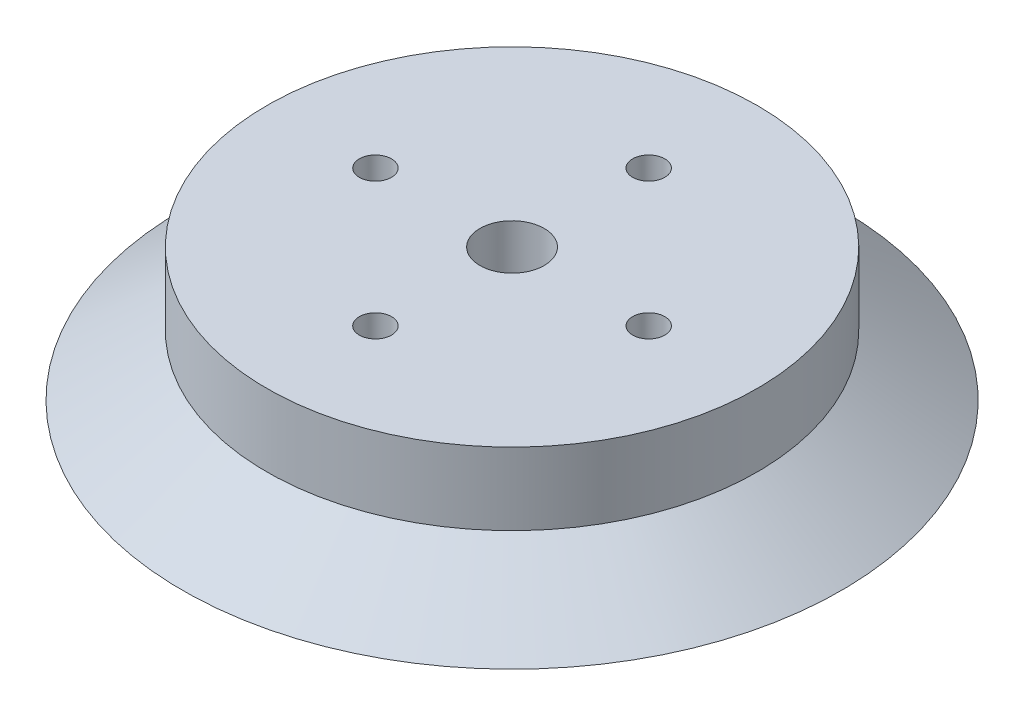
ISO-10303-21;
HEADER;
FILE_DESCRIPTION(('STEP AP214'),'2;1');
FILE_NAME('part.step','',(''),(''),'','','');
FILE_SCHEMA(('AUTOMOTIVE_DESIGN { 1 0 10303 214 1 1 1 1 }'));
ENDSEC;
DATA;
#1=APPLICATION_CONTEXT('core data for automotive mechanical design processes');
#2=APPLICATION_PROTOCOL_DEFINITION('international standard','automotive_design',2000,#1);
#3=PRODUCT_CONTEXT('',#1,'mechanical');
#4=PRODUCT('Part','Part','',(#3));
#5=PRODUCT_RELATED_PRODUCT_CATEGORY('part','',(#4));
#6=PRODUCT_DEFINITION_FORMATION('','',#4);
#7=PRODUCT_DEFINITION_CONTEXT('part definition',#1,'design');
#8=PRODUCT_DEFINITION('design','',#6,#7);
#9=PRODUCT_DEFINITION_SHAPE('','',#8);
#10=(LENGTH_UNIT() NAMED_UNIT(*) SI_UNIT(.MILLI.,.METRE.));
#11=(NAMED_UNIT(*) PLANE_ANGLE_UNIT() SI_UNIT($,.RADIAN.));
#12=(NAMED_UNIT(*) SI_UNIT($,.STERADIAN.) SOLID_ANGLE_UNIT());
#13=UNCERTAINTY_MEASURE_WITH_UNIT(LENGTH_MEASURE(1.E-05),#10,'distance_accuracy_value','');
#14=(GEOMETRIC_REPRESENTATION_CONTEXT(3) GLOBAL_UNCERTAINTY_ASSIGNED_CONTEXT((#13)) GLOBAL_UNIT_ASSIGNED_CONTEXT((#10,
#11,#12)) REPRESENTATION_CONTEXT('',''));
#15=CARTESIAN_POINT('',(0.,0.,0.));
#16=DIRECTION('',(0.,0.,1.));
#17=DIRECTION('',(1.,0.,0.));
#18=AXIS2_PLACEMENT_3D('',#15,#16,#17);
#19=CARTESIAN_POINT('',(-27.059069893183,7.5,0.));
#20=DIRECTION('',(0.,1.,0.));
#21=DIRECTION('',(0.,0.,1.));
#22=AXIS2_PLACEMENT_3D('',#19,#20,#21);
#23=PLANE('',#22);
#24=CARTESIAN_POINT('',(0.,7.5,17.));
#25=DIRECTION('',(0.,-1.,0.));
#26=DIRECTION('',(0.,0.,-1.));
#27=AXIS2_PLACEMENT_3D('',#24,#25,#26);
#28=CIRCLE('',#27,2.);
#29=CARTESIAN_POINT('',(0.,7.5,15.));
#30=VERTEX_POINT('',#29);
#31=EDGE_CURVE('E75',#30,#30,#28,.T.);
#32=ORIENTED_EDGE('',*,*,#31,.F.);
#33=EDGE_LOOP('',(#32));
#34=FACE_BOUND('',#33,.T.);
#35=CARTESIAN_POINT('',(17.,7.5,0.));
#36=DIRECTION('',(0.,-1.,0.));
#37=DIRECTION('',(0.,0.,-1.));
#38=AXIS2_PLACEMENT_3D('',#35,#36,#37);
#39=CIRCLE('',#38,2.);
#40=CARTESIAN_POINT('',(17.,7.5,-2.00000000000006));
#41=VERTEX_POINT('',#40);
#42=EDGE_CURVE('E76',#41,#41,#39,.T.);
#43=ORIENTED_EDGE('',*,*,#42,.F.);
#44=EDGE_LOOP('',(#43));
#45=FACE_BOUND('',#44,.T.);
#46=CARTESIAN_POINT('',(-1.18710365520667E-13,7.5,-17.));
#47=DIRECTION('',(0.,-1.,0.));
#48=DIRECTION('',(0.,0.,-1.));
#49=AXIS2_PLACEMENT_3D('',#46,#47,#48);
#50=CIRCLE('',#49,2.);
#51=CARTESIAN_POINT('',(-1.18710365520667E-13,7.5,-19.));
#52=VERTEX_POINT('',#51);
#53=EDGE_CURVE('E79',#52,#52,#50,.T.);
#54=ORIENTED_EDGE('',*,*,#53,.F.);
#55=EDGE_LOOP('',(#54));
#56=FACE_BOUND('',#55,.T.);
#57=CARTESIAN_POINT('',(-17.,7.5,1.78065548281E-13));
#58=DIRECTION('',(0.,-1.,0.));
#59=DIRECTION('',(0.,0.,-1.));
#60=AXIS2_PLACEMENT_3D('',#57,#58,#59);
#61=CIRCLE('',#60,2.);
#62=CARTESIAN_POINT('',(-17.,7.5,-1.99999999999982));
#63=VERTEX_POINT('',#62);
#64=EDGE_CURVE('E82',#63,#63,#61,.T.);
#65=ORIENTED_EDGE('',*,*,#64,.F.);
#66=EDGE_LOOP('',(#65));
#67=FACE_BOUND('',#66,.T.);
#68=CARTESIAN_POINT('',(0.,7.5,0.));
#69=DIRECTION('',(0.,-1.,0.));
#70=DIRECTION('',(0.,0.,-1.));
#71=AXIS2_PLACEMENT_3D('',#68,#69,#70);
#72=CIRCLE('',#71,27.059069893183);
#73=CARTESIAN_POINT('',(0.,7.5,-27.059069893183));
#74=VERTEX_POINT('',#73);
#75=EDGE_CURVE('E57',#74,#74,#72,.T.);
#76=ORIENTED_EDGE('',*,*,#75,.T.);
#77=EDGE_LOOP('',(#76));
#78=FACE_BOUND('',#77,.T.);
#79=CARTESIAN_POINT('',(0.,7.5,0.));
#80=DIRECTION('',(0.,-1.,0.));
#81=DIRECTION('',(0.,0.,-1.));
#82=AXIS2_PLACEMENT_3D('',#79,#80,#81);
#83=CIRCLE('',#82,4.);
#84=CARTESIAN_POINT('',(0.,7.5,-4.));
#85=VERTEX_POINT('',#84);
#86=EDGE_CURVE('E72',#85,#85,#83,.T.);
#87=ORIENTED_EDGE('',*,*,#86,.F.);
#88=EDGE_LOOP('',(#87));
#89=FACE_BOUND('',#88,.T.);
#90=ADVANCED_FACE('F37',(#34,#45,#56,#67,#78,#89),#23,.F.);
#91=CARTESIAN_POINT('',(0.,16.5,0.));
#92=DIRECTION('',(0.,-1.,0.));
#93=DIRECTION('',(0.,0.,-1.));
#94=AXIS2_PLACEMENT_3D('',#91,#92,#93);
#95=PLANE('',#94);
#96=CARTESIAN_POINT('',(0.,16.5,17.));
#97=DIRECTION('',(0.,-1.,0.));
#98=DIRECTION('',(0.,0.,-1.));
#99=AXIS2_PLACEMENT_3D('',#96,#97,#98);
#100=CIRCLE('',#99,2.);
#101=CARTESIAN_POINT('',(0.,16.5,15.));
#102=VERTEX_POINT('',#101);
#103=EDGE_CURVE('E60',#102,#102,#100,.T.);
#104=ORIENTED_EDGE('',*,*,#103,.T.);
#105=EDGE_LOOP('',(#104));
#106=FACE_BOUND('',#105,.T.);
#107=CARTESIAN_POINT('',(17.,16.5,0.));
#108=DIRECTION('',(0.,-1.,0.));
#109=DIRECTION('',(0.,0.,-1.));
#110=AXIS2_PLACEMENT_3D('',#107,#108,#109);
#111=CIRCLE('',#110,2.);
#112=CARTESIAN_POINT('',(17.,16.5,-2.00000000000006));
#113=VERTEX_POINT('',#112);
#114=EDGE_CURVE('E63',#113,#113,#111,.T.);
#115=ORIENTED_EDGE('',*,*,#114,.T.);
#116=EDGE_LOOP('',(#115));
#117=FACE_BOUND('',#116,.T.);
#118=CARTESIAN_POINT('',(-1.18710365520667E-13,16.5,-17.));
#119=DIRECTION('',(0.,-1.,0.));
#120=DIRECTION('',(0.,0.,-1.));
#121=AXIS2_PLACEMENT_3D('',#118,#119,#120);
#122=CIRCLE('',#121,2.);
#123=CARTESIAN_POINT('',(-1.18710365520667E-13,16.5,-19.));
#124=VERTEX_POINT('',#123);
#125=EDGE_CURVE('E66',#124,#124,#122,.T.);
#126=ORIENTED_EDGE('',*,*,#125,.T.);
#127=EDGE_LOOP('',(#126));
#128=FACE_BOUND('',#127,.T.);
#129=CARTESIAN_POINT('',(-17.,16.5,1.78065548281E-13));
#130=DIRECTION('',(0.,-1.,0.));
#131=DIRECTION('',(0.,0.,-1.));
#132=AXIS2_PLACEMENT_3D('',#129,#130,#131);
#133=CIRCLE('',#132,2.);
#134=CARTESIAN_POINT('',(-17.,16.5,-1.99999999999982));
#135=VERTEX_POINT('',#134);
#136=EDGE_CURVE('E69',#135,#135,#133,.T.);
#137=ORIENTED_EDGE('',*,*,#136,.T.);
#138=EDGE_LOOP('',(#137));
#139=FACE_BOUND('',#138,.T.);
#140=CARTESIAN_POINT('',(0.,16.5,0.));
#141=DIRECTION('',(0.,-1.,0.));
#142=DIRECTION('',(0.,0.,-1.));
#143=AXIS2_PLACEMENT_3D('',#140,#141,#142);
#144=CIRCLE('',#143,4.);
#145=CARTESIAN_POINT('',(0.,16.5,-4.));
#146=VERTEX_POINT('',#145);
#147=EDGE_CURVE('E41',#146,#146,#144,.T.);
#148=ORIENTED_EDGE('',*,*,#147,.T.);
#149=EDGE_LOOP('',(#148));
#150=FACE_BOUND('',#149,.T.);
#151=CARTESIAN_POINT('',(0.,16.5,0.));
#152=DIRECTION('',(0.,-1.,0.));
#153=DIRECTION('',(0.,0.,-1.));
#154=AXIS2_PLACEMENT_3D('',#151,#152,#153);
#155=CIRCLE('',#154,30.5);
#156=CARTESIAN_POINT('',(0.,16.5,-30.5));
#157=VERTEX_POINT('',#156);
#158=EDGE_CURVE('E10',#157,#157,#155,.T.);
#159=ORIENTED_EDGE('',*,*,#158,.F.);
#160=EDGE_LOOP('',(#159));
#161=FACE_BOUND('',#160,.T.);
#162=ADVANCED_FACE('F39',(#106,#117,#128,#139,#150,#161),#95,.F.);
#163=CARTESIAN_POINT('',(0.,0.,0.));
#164=DIRECTION('',(0.,-1.,0.));
#165=DIRECTION('',(0.,0.,-1.));
#166=AXIS2_PLACEMENT_3D('',#163,#164,#165);
#167=CYLINDRICAL_SURFACE('',#166,30.5);
#168=CARTESIAN_POINT('',(0.,7.5,0.));
#169=DIRECTION('',(0.,-1.,0.));
#170=DIRECTION('',(0.,0.,-1.));
#171=AXIS2_PLACEMENT_3D('',#168,#169,#170);
#172=CIRCLE('',#171,30.5);
#173=CARTESIAN_POINT('',(0.,7.5,-30.5));
#174=VERTEX_POINT('',#173);
#175=EDGE_CURVE('E45',#174,#174,#172,.T.);
#176=ORIENTED_EDGE('',*,*,#175,.F.);
#177=EDGE_LOOP('',(#176));
#178=FACE_BOUND('',#177,.T.);
#179=ORIENTED_EDGE('',*,*,#158,.T.);
#180=EDGE_LOOP('',(#179));
#181=FACE_BOUND('',#180,.T.);
#182=ADVANCED_FACE('F111',(#178,#181),#167,.T.);
#183=CARTESIAN_POINT('',(0.,7.5,0.));
#184=DIRECTION('',(0.,-1.,0.));
#185=DIRECTION('',(0.,0.,-1.));
#186=AXIS2_PLACEMENT_3D('',#183,#184,#185);
#187=CONICAL_SURFACE('',#186,30.5,0.950546840812075);
#188=CARTESIAN_POINT('',(0.,0.,0.));
#189=DIRECTION('',(0.,-1.,0.));
#190=DIRECTION('',(0.,0.,-1.));
#191=AXIS2_PLACEMENT_3D('',#188,#189,#190);
#192=CIRCLE('',#191,41.);
#193=CARTESIAN_POINT('',(0.,0.,-41.));
#194=VERTEX_POINT('',#193);
#195=EDGE_CURVE('E49',#194,#194,#192,.T.);
#196=ORIENTED_EDGE('',*,*,#195,.F.);
#197=EDGE_LOOP('',(#196));
#198=FACE_BOUND('',#197,.T.);
#199=ORIENTED_EDGE('',*,*,#175,.T.);
#200=EDGE_LOOP('',(#199));
#201=FACE_BOUND('',#200,.T.);
#202=ADVANCED_FACE('F117',(#198,#201),#187,.T.);
#203=CARTESIAN_POINT('',(-41.,0.,0.));
#204=DIRECTION('',(0.,1.,0.));
#205=DIRECTION('',(0.,0.,1.));
#206=AXIS2_PLACEMENT_3D('',#203,#204,#205);
#207=PLANE('',#206);
#208=CARTESIAN_POINT('',(0.,0.,0.));
#209=DIRECTION('',(0.,-1.,0.));
#210=DIRECTION('',(0.,0.,-1.));
#211=AXIS2_PLACEMENT_3D('',#208,#209,#210);
#212=CIRCLE('',#211,37.559069893183);
#213=CARTESIAN_POINT('',(0.,0.,-37.559069893183));
#214=VERTEX_POINT('',#213);
#215=EDGE_CURVE('E54',#214,#214,#212,.T.);
#216=ORIENTED_EDGE('',*,*,#215,.F.);
#217=EDGE_LOOP('',(#216));
#218=FACE_BOUND('',#217,.T.);
#219=ORIENTED_EDGE('',*,*,#195,.T.);
#220=EDGE_LOOP('',(#219));
#221=FACE_BOUND('',#220,.T.);
#222=ADVANCED_FACE('F137',(#218,#221),#207,.F.);
#223=CARTESIAN_POINT('',(0.,0.,0.));
#224=DIRECTION('',(0.,-1.,0.));
#225=DIRECTION('',(0.,0.,-1.));
#226=AXIS2_PLACEMENT_3D('',#223,#224,#225);
#227=CONICAL_SURFACE('',#226,37.559069893183,0.950546840812076);
#228=ORIENTED_EDGE('',*,*,#75,.F.);
#229=EDGE_LOOP('',(#228));
#230=FACE_BOUND('',#229,.T.);
#231=ORIENTED_EDGE('',*,*,#215,.T.);
#232=EDGE_LOOP('',(#231));
#233=FACE_BOUND('',#232,.T.);
#234=ADVANCED_FACE('F128',(#230,#233),#227,.F.);
#235=CARTESIAN_POINT('',(-17.,17.5,1.78065548281E-13));
#236=DIRECTION('',(0.,-1.,0.));
#237=DIRECTION('',(0.,0.,-1.));
#238=AXIS2_PLACEMENT_3D('',#235,#236,#237);
#239=CYLINDRICAL_SURFACE('',#238,2.);
#240=ORIENTED_EDGE('',*,*,#64,.T.);
#241=EDGE_LOOP('',(#240));
#242=FACE_BOUND('',#241,.T.);
#243=ORIENTED_EDGE('',*,*,#136,.F.);
#244=EDGE_LOOP('',(#243));
#245=FACE_BOUND('',#244,.T.);
#246=ADVANCED_FACE('F127',(#242,#245),#239,.F.);
#247=CARTESIAN_POINT('',(-1.18710365520667E-13,17.5,-17.));
#248=DIRECTION('',(0.,-1.,0.));
#249=DIRECTION('',(0.,0.,-1.));
#250=AXIS2_PLACEMENT_3D('',#247,#248,#249);
#251=CYLINDRICAL_SURFACE('',#250,2.);
#252=ORIENTED_EDGE('',*,*,#53,.T.);
#253=EDGE_LOOP('',(#252));
#254=FACE_BOUND('',#253,.T.);
#255=ORIENTED_EDGE('',*,*,#125,.F.);
#256=EDGE_LOOP('',(#255));
#257=FACE_BOUND('',#256,.T.);
#258=ADVANCED_FACE('F88',(#254,#257),#251,.F.);
#259=CARTESIAN_POINT('',(17.,17.5,0.));
#260=DIRECTION('',(0.,-1.,0.));
#261=DIRECTION('',(0.,0.,-1.));
#262=AXIS2_PLACEMENT_3D('',#259,#260,#261);
#263=CYLINDRICAL_SURFACE('',#262,2.);
#264=ORIENTED_EDGE('',*,*,#42,.T.);
#265=EDGE_LOOP('',(#264));
#266=FACE_BOUND('',#265,.T.);
#267=ORIENTED_EDGE('',*,*,#114,.F.);
#268=EDGE_LOOP('',(#267));
#269=FACE_BOUND('',#268,.T.);
#270=ADVANCED_FACE('F134',(#266,#269),#263,.F.);
#271=CARTESIAN_POINT('',(0.,17.5,17.));
#272=DIRECTION('',(0.,-1.,0.));
#273=DIRECTION('',(0.,0.,-1.));
#274=AXIS2_PLACEMENT_3D('',#271,#272,#273);
#275=CYLINDRICAL_SURFACE('',#274,2.);
#276=ORIENTED_EDGE('',*,*,#31,.T.);
#277=EDGE_LOOP('',(#276));
#278=FACE_BOUND('',#277,.T.);
#279=ORIENTED_EDGE('',*,*,#103,.F.);
#280=EDGE_LOOP('',(#279));
#281=FACE_BOUND('',#280,.T.);
#282=ADVANCED_FACE('F104',(#278,#281),#275,.F.);
#283=CARTESIAN_POINT('',(0.,17.5,0.));
#284=DIRECTION('',(0.,-1.,0.));
#285=DIRECTION('',(0.,0.,-1.));
#286=AXIS2_PLACEMENT_3D('',#283,#284,#285);
#287=CYLINDRICAL_SURFACE('',#286,4.);
#288=ORIENTED_EDGE('',*,*,#86,.T.);
#289=EDGE_LOOP('',(#288));
#290=FACE_BOUND('',#289,.T.);
#291=ORIENTED_EDGE('',*,*,#147,.F.);
#292=EDGE_LOOP('',(#291));
#293=FACE_BOUND('',#292,.T.);
#294=ADVANCED_FACE('F101',(#290,#293),#287,.F.);
#295=CLOSED_SHELL('',(#90,#162,#182,#202,#222,#234,#246,#258,#270,#282,#294));
#296=MANIFOLD_SOLID_BREP('B2',#295);
#297=ADVANCED_BREP_SHAPE_REPRESENTATION('',(#18,#296),#14);
#298=SHAPE_DEFINITION_REPRESENTATION(#9,#297);
ENDSEC;
END-ISO-10303-21;
